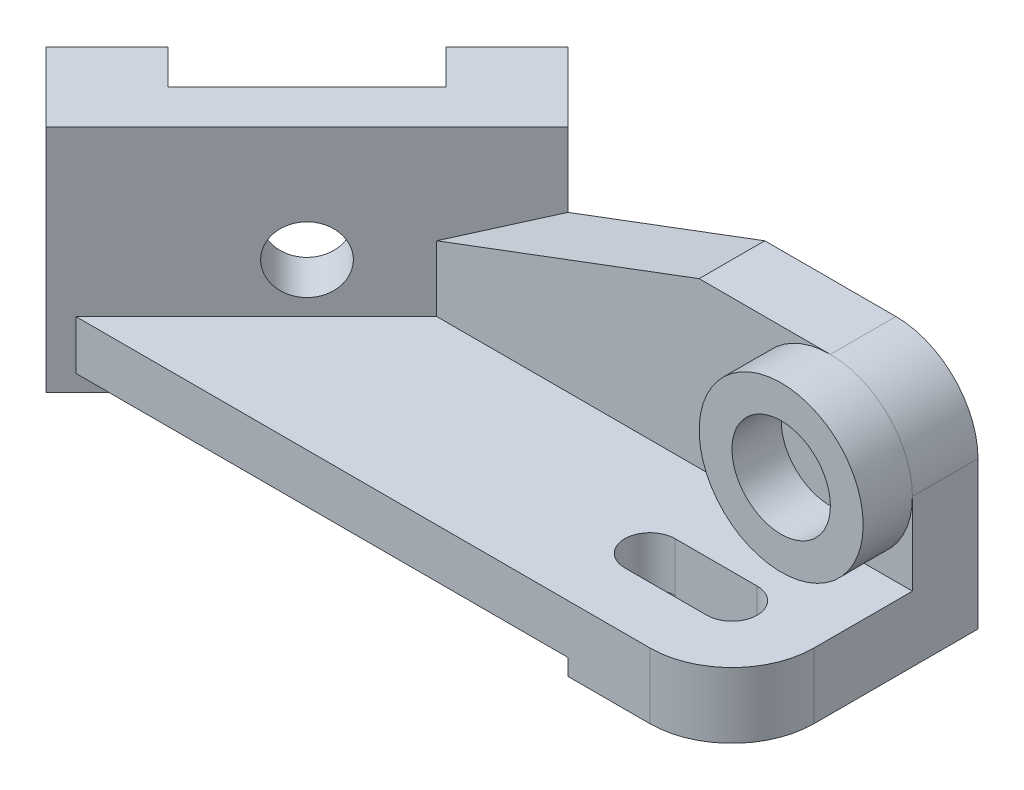
ISO-10303-21;
HEADER;
FILE_DESCRIPTION(('STEP AP214'),'2;1');
FILE_NAME('part.step','',(''),(''),'','','');
FILE_SCHEMA(('AUTOMOTIVE_DESIGN { 1 0 10303 214 1 1 1 1 }'));
ENDSEC;
DATA;
#1=APPLICATION_CONTEXT('core data for automotive mechanical design processes');
#2=APPLICATION_PROTOCOL_DEFINITION('international standard','automotive_design',2000,#1);
#3=PRODUCT_CONTEXT('',#1,'mechanical');
#4=PRODUCT('Part','Part','',(#3));
#5=PRODUCT_RELATED_PRODUCT_CATEGORY('part','',(#4));
#6=PRODUCT_DEFINITION_FORMATION('','',#4);
#7=PRODUCT_DEFINITION_CONTEXT('part definition',#1,'design');
#8=PRODUCT_DEFINITION('design','',#6,#7);
#9=PRODUCT_DEFINITION_SHAPE('','',#8);
#10=(LENGTH_UNIT() NAMED_UNIT(*) SI_UNIT(.MILLI.,.METRE.));
#11=(NAMED_UNIT(*) PLANE_ANGLE_UNIT() SI_UNIT($,.RADIAN.));
#12=(NAMED_UNIT(*) SI_UNIT($,.STERADIAN.) SOLID_ANGLE_UNIT());
#13=UNCERTAINTY_MEASURE_WITH_UNIT(LENGTH_MEASURE(1.E-05),#10,'distance_accuracy_value','');
#14=(GEOMETRIC_REPRESENTATION_CONTEXT(3) GLOBAL_UNCERTAINTY_ASSIGNED_CONTEXT((#13)) GLOBAL_UNIT_ASSIGNED_CONTEXT((#10,
#11,#12)) REPRESENTATION_CONTEXT('',''));
#15=CARTESIAN_POINT('',(0.,0.,0.));
#16=DIRECTION('',(0.,0.,1.));
#17=DIRECTION('',(1.,0.,0.));
#18=AXIS2_PLACEMENT_3D('',#15,#16,#17);
#19=CARTESIAN_POINT('',(0.,140.,0.));
#20=DIRECTION('',(0.,-1.,0.));
#21=DIRECTION('',(0.,0.,-1.));
#22=AXIS2_PLACEMENT_3D('',#19,#20,#21);
#23=PLANE('',#22);
#24=DIRECTION('',(0.707106781186548,0.,-0.707106781186548));
#25=VECTOR('',#24,1.);
#26=CARTESIAN_POINT('',(-250.,140.,-149.999999999998));
#27=LINE('',#26,#25);
#28=CARTESIAN_POINT('',(-409.099025766973,140.,9.09902576697477));
#29=VERTEX_POINT('',#28);
#30=CARTESIAN_POINT('',(-250.000000000002,140.,-150.));
#31=VERTEX_POINT('',#30);
#32=EDGE_CURVE('E315',#29,#31,#27,.T.);
#33=ORIENTED_EDGE('',*,*,#32,.T.);
#34=DIRECTION('',(-0.707106781186546,0.,-0.707106781186549));
#35=VECTOR('',#34,1.);
#36=CARTESIAN_POINT('',(-292.426406871193,140.,-192.426406871191));
#37=LINE('',#36,#35);
#38=CARTESIAN_POINT('',(-292.426406871193,140.,-192.426406871191));
#39=VERTEX_POINT('',#38);
#40=EDGE_CURVE('E317',#31,#39,#37,.T.);
#41=ORIENTED_EDGE('',*,*,#40,.T.);
#42=DIRECTION('',(-0.707106781186548,0.,0.707106781186547));
#43=VECTOR('',#42,1.);
#44=CARTESIAN_POINT('',(-329.549512883486,140.,-155.303300858897));
#45=LINE('',#44,#43);
#46=CARTESIAN_POINT('',(-329.549512883486,140.,-155.303300858897));
#47=VERTEX_POINT('',#46);
#48=EDGE_CURVE('E301',#39,#47,#45,.T.);
#49=ORIENTED_EDGE('',*,*,#48,.T.);
#50=DIRECTION('',(0.707106781186547,0.,0.707106781186548));
#51=VECTOR('',#50,1.);
#52=CARTESIAN_POINT('',(-308.33630944789,140.,-134.090097423301));
#53=LINE('',#52,#51);
#54=CARTESIAN_POINT('',(-308.33630944789,140.,-134.090097423301));
#55=VERTEX_POINT('',#54);
#56=EDGE_CURVE('E304',#47,#55,#53,.T.);
#57=ORIENTED_EDGE('',*,*,#56,.T.);
#58=DIRECTION('',(-0.707106781186547,0.,0.707106781186548));
#59=VECTOR('',#58,1.);
#60=CARTESIAN_POINT('',(-393.189123190276,140.,-49.2372836809154));
#61=LINE('',#60,#59);
#62=CARTESIAN_POINT('',(-393.189123190276,140.,-49.2372836809154));
#63=VERTEX_POINT('',#62);
#64=EDGE_CURVE('E307',#55,#63,#61,.T.);
#65=ORIENTED_EDGE('',*,*,#64,.T.);
#66=DIRECTION('',(-0.707106781186546,0.,-0.707106781186549));
#67=VECTOR('',#66,1.);
#68=CARTESIAN_POINT('',(-414.402326625872,140.,-70.4504871165119));
#69=LINE('',#68,#67);
#70=CARTESIAN_POINT('',(-414.402326625872,140.,-70.4504871165119));
#71=VERTEX_POINT('',#70);
#72=EDGE_CURVE('E309',#63,#71,#69,.T.);
#73=ORIENTED_EDGE('',*,*,#72,.T.);
#74=DIRECTION('',(-0.707106781186548,0.,0.707106781186547));
#75=VECTOR('',#74,1.);
#76=CARTESIAN_POINT('',(-451.525432638166,140.,-33.3273811042181));
#77=LINE('',#76,#75);
#78=CARTESIAN_POINT('',(-451.525432638166,140.,-33.3273811042181));
#79=VERTEX_POINT('',#78);
#80=EDGE_CURVE('E311',#71,#79,#77,.T.);
#81=ORIENTED_EDGE('',*,*,#80,.T.);
#82=DIRECTION('',(0.707106781186548,0.,0.707106781186547));
#83=VECTOR('',#82,1.);
#84=CARTESIAN_POINT('',(-409.099025766973,140.,9.09902576697477));
#85=LINE('',#84,#83);
#86=EDGE_CURVE('E313',#79,#29,#85,.T.);
#87=ORIENTED_EDGE('',*,*,#86,.T.);
#88=EDGE_LOOP('',(#33,#41,#49,#57,#65,#73,#81,#87));
#89=FACE_BOUND('',#88,.T.);
#90=ADVANCED_FACE('F33',(#89),#23,.F.);
#91=CARTESIAN_POINT('',(0.,432.745623366091,-110.));
#92=DIRECTION('',(0.,0.,-1.));
#93=DIRECTION('',(-1.,0.,0.));
#94=AXIS2_PLACEMENT_3D('',#91,#92,#93);
#95=PLANE('',#94);
#96=CARTESIAN_POINT('',(-50.,90.,-110.));
#97=DIRECTION('',(0.,0.,-1.));
#98=DIRECTION('',(-1.,0.,0.));
#99=AXIS2_PLACEMENT_3D('',#96,#97,#98);
#100=CIRCLE('',#99,50.);
#101=CARTESIAN_POINT('',(-50.,40.,-110.));
#102=VERTEX_POINT('',#101);
#103=CARTESIAN_POINT('',(0.,90.,-110.));
#104=VERTEX_POINT('',#103);
#105=EDGE_CURVE('E461',#102,#104,#100,.F.);
#106=ORIENTED_EDGE('',*,*,#105,.F.);
#107=DIRECTION('',(1.,0.,0.));
#108=VECTOR('',#107,1.);
#109=CARTESIAN_POINT('',(0.,40.,-110.));
#110=LINE('',#109,#108);
#111=CARTESIAN_POINT('',(0.,40.,-110.));
#112=VERTEX_POINT('',#111);
#113=EDGE_CURVE('E558',#102,#112,#110,.T.);
#114=ORIENTED_EDGE('',*,*,#113,.T.);
#115=DIRECTION('',(0.,-1.,0.));
#116=VECTOR('',#115,1.);
#117=CARTESIAN_POINT('',(0.,432.745623366091,-110.));
#118=LINE('',#117,#116);
#119=EDGE_CURVE('E563',#104,#112,#118,.T.);
#120=ORIENTED_EDGE('',*,*,#119,.F.);
#121=EDGE_LOOP('',(#106,#114,#120));
#122=FACE_BOUND('',#121,.T.);
#123=ADVANCED_FACE('F585',(#122),#95,.F.);
#124=CARTESIAN_POINT('',(-400.,40.,-150.));
#125=DIRECTION('',(0.,1.,0.));
#126=DIRECTION('',(0.,0.,1.));
#127=AXIS2_PLACEMENT_3D('',#124,#125,#126);
#128=PLANE('',#127);
#129=CARTESIAN_POINT('',(-50.,40.,-50.));
#130=DIRECTION('',(0.,1.,0.));
#131=DIRECTION('',(0.,0.,1.));
#132=AXIS2_PLACEMENT_3D('',#129,#130,#131);
#133=CIRCLE('',#132,15.3786470838639);
#134=CARTESIAN_POINT('',(-50.,40.,-34.6213529161361));
#135=VERTEX_POINT('',#134);
#136=CARTESIAN_POINT('',(-50.,40.,-65.378647083864));
#137=VERTEX_POINT('',#136);
#138=EDGE_CURVE('E366',#135,#137,#133,.T.);
#139=ORIENTED_EDGE('',*,*,#138,.F.);
#140=DIRECTION('',(1.,0.,0.));
#141=VECTOR('',#140,1.);
#142=CARTESIAN_POINT('',(-50.,40.,-34.6213529161361));
#143=LINE('',#142,#141);
#144=CARTESIAN_POINT('',(-100.,40.,-34.6213529161361));
#145=VERTEX_POINT('',#144);
#146=EDGE_CURVE('E371',#145,#135,#143,.T.);
#147=ORIENTED_EDGE('',*,*,#146,.F.);
#148=CARTESIAN_POINT('',(-100.,40.,-50.));
#149=DIRECTION('',(0.,1.,0.));
#150=DIRECTION('',(0.,0.,1.));
#151=AXIS2_PLACEMENT_3D('',#148,#149,#150);
#152=CIRCLE('',#151,15.3786470838639);
#153=CARTESIAN_POINT('',(-100.,40.,-65.3786470838639));
#154=VERTEX_POINT('',#153);
#155=EDGE_CURVE('E382',#154,#145,#152,.T.);
#156=ORIENTED_EDGE('',*,*,#155,.F.);
#157=DIRECTION('',(-1.,0.,0.));
#158=VECTOR('',#157,1.);
#159=CARTESIAN_POINT('',(-50.,40.,-65.378647083864));
#160=LINE('',#159,#158);
#161=EDGE_CURVE('E379',#137,#154,#160,.T.);
#162=ORIENTED_EDGE('',*,*,#161,.F.);
#163=EDGE_LOOP('',(#139,#147,#156,#162));
#164=FACE_BOUND('',#163,.T.);
#165=DIRECTION('',(0.,0.,1.));
#166=VECTOR('',#165,1.);
#167=CARTESIAN_POINT('',(0.,40.,-150.));
#168=LINE('',#167,#166);
#169=CARTESIAN_POINT('',(0.,40.,-50.));
#170=VERTEX_POINT('',#169);
#171=EDGE_CURVE('E422',#112,#170,#168,.T.);
#172=ORIENTED_EDGE('',*,*,#171,.F.);
#173=ORIENTED_EDGE('',*,*,#113,.F.);
#174=CARTESIAN_POINT('',(-290.000000000002,40.,-110.));
#175=VERTEX_POINT('',#174);
#176=EDGE_CURVE('E499',#175,#102,#110,.T.);
#177=ORIENTED_EDGE('',*,*,#176,.F.);
#178=DIRECTION('',(0.707106781186544,0.,-0.707106781186552));
#179=VECTOR('',#178,1.);
#180=CARTESIAN_POINT('',(-400.,40.,0.));
#181=LINE('',#180,#179);
#182=CARTESIAN_POINT('',(-399.999999999998,40.,0.));
#183=VERTEX_POINT('',#182);
#184=EDGE_CURVE('E400',#183,#175,#181,.T.);
#185=ORIENTED_EDGE('',*,*,#184,.F.);
#186=DIRECTION('',(-1.,0.,0.));
#187=VECTOR('',#186,1.);
#188=CARTESIAN_POINT('',(-400.,40.,0.));
#189=LINE('',#188,#187);
#190=CARTESIAN_POINT('',(-50.,40.,0.));
#191=VERTEX_POINT('',#190);
#192=EDGE_CURVE('E409',#191,#183,#189,.T.);
#193=ORIENTED_EDGE('',*,*,#192,.F.);
#194=CARTESIAN_POINT('',(-50.,40.,-50.));
#195=DIRECTION('',(0.,1.,0.));
#196=DIRECTION('',(0.,0.,1.));
#197=AXIS2_PLACEMENT_3D('',#194,#195,#196);
#198=CIRCLE('',#197,50.);
#199=EDGE_CURVE('E451',#191,#170,#198,.T.);
#200=ORIENTED_EDGE('',*,*,#199,.T.);
#201=EDGE_LOOP('',(#172,#173,#177,#185,#193,#200));
#202=FACE_BOUND('',#201,.T.);
#203=ADVANCED_FACE('F496',(#164,#202),#128,.T.);
#204=CARTESIAN_POINT('',(-250.,140.,-149.999999999998));
#205=DIRECTION('',(-0.707106781186548,0.,-0.707106781186548));
#206=DIRECTION('',(-0.707106781186548,0.,0.707106781186548));
#207=AXIS2_PLACEMENT_3D('',#204,#205,#206);
#208=PLANE('',#207);
#209=CARTESIAN_POINT('',(-329.549512883487,70.,-70.4504871165117));
#210=DIRECTION('',(-0.707106781186548,0.,-0.707106781186548));
#211=DIRECTION('',(-0.707106781186548,0.,0.707106781186548));
#212=AXIS2_PLACEMENT_3D('',#209,#210,#211);
#213=CIRCLE('',#212,20.);
#214=CARTESIAN_POINT('',(-343.691648507217,70.,-56.3083514927808));
#215=VERTEX_POINT('',#214);
#216=EDGE_CURVE('E282',#215,#215,#213,.F.);
#217=ORIENTED_EDGE('',*,*,#216,.F.);
#218=EDGE_LOOP('',(#217));
#219=FACE_BOUND('',#218,.T.);
#220=DIRECTION('',(0.,-1.,0.));
#221=VECTOR('',#220,1.);
#222=CARTESIAN_POINT('',(-290.000000000002,432.745623366091,-110.));
#223=LINE('',#222,#221);
#224=CARTESIAN_POINT('',(-290.000000000002,80.,-110.));
#225=VERTEX_POINT('',#224);
#226=EDGE_CURVE('E503',#225,#175,#223,.T.);
#227=ORIENTED_EDGE('',*,*,#226,.F.);
#228=DIRECTION('',(0.683486126173409,0.256307297315028,-0.683486126173409));
#229=VECTOR('',#228,1.);
#230=CARTESIAN_POINT('',(-304.887671676443,74.4171231213345,-95.1123283235585));
#231=LINE('',#230,#229);
#232=CARTESIAN_POINT('',(-250.,95.0000000000007,-149.999999999998));
#233=VERTEX_POINT('',#232);
#234=EDGE_CURVE('E48',#225,#233,#231,.T.);
#235=ORIENTED_EDGE('',*,*,#234,.T.);
#236=DIRECTION('',(0.,1.,0.));
#237=VECTOR('',#236,1.);
#238=CARTESIAN_POINT('',(-250.000000000002,-4.98379248635319,-150.));
#239=LINE('',#238,#237);
#240=EDGE_CURVE('E537',#233,#31,#239,.T.);
#241=ORIENTED_EDGE('',*,*,#240,.T.);
#242=ORIENTED_EDGE('',*,*,#32,.F.);
#243=DIRECTION('',(0.,-1.,0.));
#244=VECTOR('',#243,1.);
#245=CARTESIAN_POINT('',(-409.099025766973,140.,9.09902576697477));
#246=LINE('',#245,#244);
#247=CARTESIAN_POINT('',(-409.099025766973,0.,9.09902576697477));
#248=VERTEX_POINT('',#247);
#249=EDGE_CURVE('E345',#29,#248,#246,.T.);
#250=ORIENTED_EDGE('',*,*,#249,.T.);
#251=DIRECTION('',(0.707106781186548,0.,-0.707106781186548));
#252=VECTOR('',#251,1.);
#253=CARTESIAN_POINT('',(-250.,0.,-149.999999999998));
#254=LINE('',#253,#252);
#255=CARTESIAN_POINT('',(-250.,0.,-149.999999999998));
#256=VERTEX_POINT('',#255);
#257=EDGE_CURVE('E336',#248,#256,#254,.T.);
#258=ORIENTED_EDGE('',*,*,#257,.T.);
#259=DIRECTION('',(0.,-1.,0.));
#260=VECTOR('',#259,1.);
#261=CARTESIAN_POINT('',(-250.,140.,-149.999999999998));
#262=LINE('',#261,#260);
#263=CARTESIAN_POINT('',(-250.,9.99999999999995,-149.999999999998));
#264=VERTEX_POINT('',#263);
#265=EDGE_CURVE('E343',#264,#256,#262,.T.);
#266=ORIENTED_EDGE('',*,*,#265,.F.);
#267=DIRECTION('',(0.707106781186543,0.,-0.707106781186552));
#268=VECTOR('',#267,1.);
#269=CARTESIAN_POINT('',(-400.,9.99999999999995,0.));
#270=LINE('',#269,#268);
#271=CARTESIAN_POINT('',(-399.999999999998,9.99999999999995,0.));
#272=VERTEX_POINT('',#271);
#273=EDGE_CURVE('E406',#272,#264,#270,.T.);
#274=ORIENTED_EDGE('',*,*,#273,.F.);
#275=DIRECTION('',(0.,-1.,0.));
#276=VECTOR('',#275,1.);
#277=CARTESIAN_POINT('',(-400.,9.99999999999995,0.));
#278=LINE('',#277,#276);
#279=EDGE_CURVE('E425',#183,#272,#278,.T.);
#280=ORIENTED_EDGE('',*,*,#279,.F.);
#281=ORIENTED_EDGE('',*,*,#184,.T.);
#282=EDGE_LOOP('',(#227,#235,#241,#242,#250,#258,#266,#274,#280,#281));
#283=FACE_BOUND('',#282,.T.);
#284=ADVANCED_FACE('F502',(#219,#283),#208,.F.);
#285=CARTESIAN_POINT('',(-329.549512883486,140.,-155.303300858897));
#286=DIRECTION('',(0.707106781186547,0.,0.707106781186548));
#287=DIRECTION('',(0.707106781186548,0.,-0.707106781186547));
#288=AXIS2_PLACEMENT_3D('',#285,#286,#287);
#289=PLANE('',#288);
#290=DIRECTION('',(0.,-1.,0.));
#291=VECTOR('',#290,1.);
#292=CARTESIAN_POINT('',(-292.426406871193,140.,-192.426406871191));
#293=LINE('',#292,#291);
#294=CARTESIAN_POINT('',(-292.426406871193,120.,-192.426406871191));
#295=VERTEX_POINT('',#294);
#296=EDGE_CURVE('E341',#39,#295,#293,.T.);
#297=ORIENTED_EDGE('',*,*,#296,.T.);
#298=DIRECTION('',(-0.707106781186547,0.,0.707106781186547));
#299=VECTOR('',#298,1.);
#300=CARTESIAN_POINT('',(-292.426406871193,120.,-192.426406871191));
#301=LINE('',#300,#299);
#302=CARTESIAN_POINT('',(-329.549512883486,120.,-155.303300858897));
#303=VERTEX_POINT('',#302);
#304=EDGE_CURVE('E270',#295,#303,#301,.T.);
#305=ORIENTED_EDGE('',*,*,#304,.T.);
#306=DIRECTION('',(0.,-1.,0.));
#307=VECTOR('',#306,1.);
#308=CARTESIAN_POINT('',(-329.549512883486,140.,-155.303300858897));
#309=LINE('',#308,#307);
#310=EDGE_CURVE('E363',#47,#303,#309,.T.);
#311=ORIENTED_EDGE('',*,*,#310,.F.);
#312=ORIENTED_EDGE('',*,*,#48,.F.);
#313=EDGE_LOOP('',(#297,#305,#311,#312));
#314=FACE_BOUND('',#313,.T.);
#315=ADVANCED_FACE('F574',(#314),#289,.F.);
#316=CARTESIAN_POINT('',(-308.33630944789,140.,-134.090097423301));
#317=DIRECTION('',(0.707106781186548,0.,-0.707106781186547));
#318=DIRECTION('',(-0.707106781186547,0.,-0.707106781186548));
#319=AXIS2_PLACEMENT_3D('',#316,#317,#318);
#320=PLANE('',#319);
#321=ORIENTED_EDGE('',*,*,#310,.T.);
#322=DIRECTION('',(0.588348405414552,-0.554700196225229,0.588348405414553));
#323=VECTOR('',#322,1.);
#324=CARTESIAN_POINT('',(-321.39058848518,112.307692307692,-147.144376460591));
#325=LINE('',#324,#323);
#326=CARTESIAN_POINT('',(-308.33630944789,100.,-134.090097423301));
#327=VERTEX_POINT('',#326);
#328=EDGE_CURVE('E298',#303,#327,#325,.T.);
#329=ORIENTED_EDGE('',*,*,#328,.T.);
#330=DIRECTION('',(0.,-1.,0.));
#331=VECTOR('',#330,1.);
#332=CARTESIAN_POINT('',(-308.33630944789,140.,-134.090097423301));
#333=LINE('',#332,#331);
#334=EDGE_CURVE('E263',#55,#327,#333,.T.);
#335=ORIENTED_EDGE('',*,*,#334,.F.);
#336=ORIENTED_EDGE('',*,*,#56,.F.);
#337=EDGE_LOOP('',(#321,#329,#335,#336));
#338=FACE_BOUND('',#337,.T.);
#339=ADVANCED_FACE('F580',(#338),#320,.F.);
#340=CARTESIAN_POINT('',(-414.402326625872,140.,-70.4504871165119));
#341=DIRECTION('',(-0.707106781186549,0.,0.707106781186546));
#342=DIRECTION('',(0.707106781186546,0.,0.707106781186549));
#343=AXIS2_PLACEMENT_3D('',#340,#341,#342);
#344=PLANE('',#343);
#345=DIRECTION('',(0.,-1.,0.));
#346=VECTOR('',#345,1.);
#347=CARTESIAN_POINT('',(-393.189123190276,140.,-49.2372836809154));
#348=LINE('',#347,#346);
#349=CARTESIAN_POINT('',(-393.189123190276,100.,-49.2372836809154));
#350=VERTEX_POINT('',#349);
#351=EDGE_CURVE('E357',#63,#350,#348,.T.);
#352=ORIENTED_EDGE('',*,*,#351,.T.);
#353=DIRECTION('',(-0.588348405414551,0.554700196225229,-0.588348405414553));
#354=VECTOR('',#353,1.);
#355=CARTESIAN_POINT('',(-420.929466144517,126.153846153846,-76.9776266351569));
#356=LINE('',#355,#354);
#357=CARTESIAN_POINT('',(-414.402326625872,120.,-70.4504871165118));
#358=VERTEX_POINT('',#357);
#359=EDGE_CURVE('E296',#350,#358,#356,.T.);
#360=ORIENTED_EDGE('',*,*,#359,.T.);
#361=DIRECTION('',(0.,-1.,0.));
#362=VECTOR('',#361,1.);
#363=CARTESIAN_POINT('',(-414.402326625872,140.,-70.4504871165119));
#364=LINE('',#363,#362);
#365=EDGE_CURVE('E353',#71,#358,#364,.T.);
#366=ORIENTED_EDGE('',*,*,#365,.F.);
#367=ORIENTED_EDGE('',*,*,#72,.F.);
#368=EDGE_LOOP('',(#352,#360,#366,#367));
#369=FACE_BOUND('',#368,.T.);
#370=ADVANCED_FACE('F626',(#369),#344,.F.);
#371=CARTESIAN_POINT('',(-451.525432638166,140.,-33.3273811042181));
#372=DIRECTION('',(0.707106781186547,0.,0.707106781186548));
#373=DIRECTION('',(0.707106781186548,0.,-0.707106781186547));
#374=AXIS2_PLACEMENT_3D('',#371,#372,#373);
#375=PLANE('',#374);
#376=ORIENTED_EDGE('',*,*,#365,.T.);
#377=CARTESIAN_POINT('',(-451.525432638166,120.,-33.327381104218));
#378=VERTEX_POINT('',#377);
#379=EDGE_CURVE('E265',#358,#378,#301,.T.);
#380=ORIENTED_EDGE('',*,*,#379,.T.);
#381=DIRECTION('',(0.,-1.,0.));
#382=VECTOR('',#381,1.);
#383=CARTESIAN_POINT('',(-451.525432638166,140.,-33.3273811042181));
#384=LINE('',#383,#382);
#385=EDGE_CURVE('E349',#79,#378,#384,.T.);
#386=ORIENTED_EDGE('',*,*,#385,.F.);
#387=ORIENTED_EDGE('',*,*,#80,.F.);
#388=EDGE_LOOP('',(#376,#380,#386,#387));
#389=FACE_BOUND('',#388,.T.);
#390=ADVANCED_FACE('F621',(#389),#375,.F.);
#391=CARTESIAN_POINT('',(-100.,0.,-150.));
#392=DIRECTION('',(-1.,0.,0.));
#393=DIRECTION('',(0.,0.,1.));
#394=AXIS2_PLACEMENT_3D('',#391,#392,#393);
#395=PLANE('',#394);
#396=DIRECTION('',(0.,1.,0.));
#397=VECTOR('',#396,1.);
#398=CARTESIAN_POINT('',(-100.,0.,-34.6213529161361));
#399=LINE('',#398,#397);
#400=CARTESIAN_POINT('',(-100.,0.,-34.6213529161361));
#401=VERTEX_POINT('',#400);
#402=CARTESIAN_POINT('',(-100.,9.99999999999999,-34.6213529161361));
#403=VERTEX_POINT('',#402);
#404=EDGE_CURVE('E390',#401,#403,#399,.T.);
#405=ORIENTED_EDGE('',*,*,#404,.F.);
#406=DIRECTION('',(0.,0.,1.));
#407=VECTOR('',#406,1.);
#408=CARTESIAN_POINT('',(-100.,0.,-150.));
#409=LINE('',#408,#407);
#410=CARTESIAN_POINT('',(-100.,0.,0.));
#411=VERTEX_POINT('',#410);
#412=EDGE_CURVE('E443',#401,#411,#409,.T.);
#413=ORIENTED_EDGE('',*,*,#412,.T.);
#414=DIRECTION('',(0.,-1.,0.));
#415=VECTOR('',#414,1.);
#416=CARTESIAN_POINT('',(-100.,0.,0.));
#417=LINE('',#416,#415);
#418=CARTESIAN_POINT('',(-100.,9.99999999999999,0.));
#419=VERTEX_POINT('',#418);
#420=EDGE_CURVE('E431',#419,#411,#417,.T.);
#421=ORIENTED_EDGE('',*,*,#420,.F.);
#422=DIRECTION('',(0.,0.,1.));
#423=VECTOR('',#422,1.);
#424=CARTESIAN_POINT('',(-100.,9.99999999999999,-150.));
#425=LINE('',#424,#423);
#426=EDGE_CURVE('E447',#403,#419,#425,.T.);
#427=ORIENTED_EDGE('',*,*,#426,.F.);
#428=EDGE_LOOP('',(#405,#413,#421,#427));
#429=FACE_BOUND('',#428,.T.);
#430=ADVANCED_FACE('F513',(#429),#395,.T.);
#431=CARTESIAN_POINT('',(0.,40.,-150.));
#432=DIRECTION('',(1.,0.,0.));
#433=DIRECTION('',(0.,1.,0.));
#434=AXIS2_PLACEMENT_3D('',#431,#432,#433);
#435=PLANE('',#434);
#436=DIRECTION('',(0.,1.,0.));
#437=VECTOR('',#436,1.);
#438=CARTESIAN_POINT('',(0.,40.,-150.));
#439=LINE('',#438,#437);
#440=CARTESIAN_POINT('',(0.,0.,-150.));
#441=VERTEX_POINT('',#440);
#442=CARTESIAN_POINT('',(0.,90.,-150.));
#443=VERTEX_POINT('',#442);
#444=EDGE_CURVE('E410',#441,#443,#439,.T.);
#445=ORIENTED_EDGE('',*,*,#444,.T.);
#446=DIRECTION('',(0.,0.,1.));
#447=VECTOR('',#446,1.);
#448=CARTESIAN_POINT('',(0.,90.,-110.));
#449=LINE('',#448,#447);
#450=EDGE_CURVE('E462',#443,#104,#449,.T.);
#451=ORIENTED_EDGE('',*,*,#450,.T.);
#452=ORIENTED_EDGE('',*,*,#119,.T.);
#453=ORIENTED_EDGE('',*,*,#171,.T.);
#454=DIRECTION('',(0.,1.,0.));
#455=VECTOR('',#454,1.);
#456=CARTESIAN_POINT('',(0.,0.,-50.));
#457=LINE('',#456,#455);
#458=CARTESIAN_POINT('',(0.,0.,-50.));
#459=VERTEX_POINT('',#458);
#460=EDGE_CURVE('E454',#170,#459,#457,.F.);
#461=ORIENTED_EDGE('',*,*,#460,.T.);
#462=DIRECTION('',(0.,0.,1.));
#463=VECTOR('',#462,1.);
#464=CARTESIAN_POINT('',(0.,0.,-150.));
#465=LINE('',#464,#463);
#466=EDGE_CURVE('E436',#441,#459,#465,.T.);
#467=ORIENTED_EDGE('',*,*,#466,.F.);
#468=EDGE_LOOP('',(#445,#451,#452,#453,#461,#467));
#469=FACE_BOUND('',#468,.T.);
#470=ADVANCED_FACE('F479',(#469),#435,.T.);
#471=CARTESIAN_POINT('',(0.,0.,-150.));
#472=DIRECTION('',(0.,-1.,0.));
#473=DIRECTION('',(1.,0.,0.));
#474=AXIS2_PLACEMENT_3D('',#471,#472,#473);
#475=PLANE('',#474);
#476=DIRECTION('',(1.,0.,0.));
#477=VECTOR('',#476,1.);
#478=CARTESIAN_POINT('',(-50.,0.,-34.6213529161361));
#479=LINE('',#478,#477);
#480=CARTESIAN_POINT('',(-50.,0.,-34.6213529161361));
#481=VERTEX_POINT('',#480);
#482=EDGE_CURVE('E374',#401,#481,#479,.T.);
#483=ORIENTED_EDGE('',*,*,#482,.T.);
#484=CARTESIAN_POINT('',(-50.,0.,-50.));
#485=DIRECTION('',(0.,1.,0.));
#486=DIRECTION('',(0.,0.,1.));
#487=AXIS2_PLACEMENT_3D('',#484,#485,#486);
#488=CIRCLE('',#487,15.3786470838639);
#489=CARTESIAN_POINT('',(-50.,0.,-65.378647083864));
#490=VERTEX_POINT('',#489);
#491=EDGE_CURVE('E367',#481,#490,#488,.T.);
#492=ORIENTED_EDGE('',*,*,#491,.T.);
#493=DIRECTION('',(-1.,0.,0.));
#494=VECTOR('',#493,1.);
#495=CARTESIAN_POINT('',(-50.,0.,-65.378647083864));
#496=LINE('',#495,#494);
#497=CARTESIAN_POINT('',(-100.,0.,-65.3786470838639));
#498=VERTEX_POINT('',#497);
#499=EDGE_CURVE('E370',#490,#498,#496,.T.);
#500=ORIENTED_EDGE('',*,*,#499,.T.);
#501=CARTESIAN_POINT('',(-100.,0.,-150.));
#502=VERTEX_POINT('',#501);
#503=EDGE_CURVE('E440',#502,#498,#409,.T.);
#504=ORIENTED_EDGE('',*,*,#503,.F.);
#505=DIRECTION('',(1.,0.,0.));
#506=VECTOR('',#505,1.);
#507=CARTESIAN_POINT('',(0.,0.,-150.));
#508=LINE('',#507,#506);
#509=EDGE_CURVE('E419',#502,#441,#508,.T.);
#510=ORIENTED_EDGE('',*,*,#509,.T.);
#511=ORIENTED_EDGE('',*,*,#466,.T.);
#512=CARTESIAN_POINT('',(-50.,0.,-50.));
#513=DIRECTION('',(0.,-1.,0.));
#514=DIRECTION('',(1.,0.,0.));
#515=AXIS2_PLACEMENT_3D('',#512,#513,#514);
#516=CIRCLE('',#515,50.);
#517=CARTESIAN_POINT('',(-50.,0.,0.));
#518=VERTEX_POINT('',#517);
#519=EDGE_CURVE('E456',#459,#518,#516,.T.);
#520=ORIENTED_EDGE('',*,*,#519,.T.);
#521=DIRECTION('',(1.,0.,0.));
#522=VECTOR('',#521,1.);
#523=CARTESIAN_POINT('',(0.,0.,0.));
#524=LINE('',#523,#522);
#525=EDGE_CURVE('E414',#411,#518,#524,.T.);
#526=ORIENTED_EDGE('',*,*,#525,.F.);
#527=ORIENTED_EDGE('',*,*,#412,.F.);
#528=EDGE_LOOP('',(#483,#492,#500,#504,#510,#511,#520,#526,#527));
#529=FACE_BOUND('',#528,.T.);
#530=ADVANCED_FACE('F485',(#529),#475,.T.);
#531=DIRECTION('',(0.,1.,0.));
#532=VECTOR('',#531,1.);
#533=CARTESIAN_POINT('',(-100.,0.,-65.3786470838639));
#534=LINE('',#533,#532);
#535=CARTESIAN_POINT('',(-100.,9.99999999999999,-65.3786470838639));
#536=VERTEX_POINT('',#535);
#537=EDGE_CURVE('E393',#498,#536,#534,.T.);
#538=ORIENTED_EDGE('',*,*,#537,.T.);
#539=CARTESIAN_POINT('',(-100.,9.99999999999999,-150.));
#540=VERTEX_POINT('',#539);
#541=EDGE_CURVE('E444',#540,#536,#425,.T.);
#542=ORIENTED_EDGE('',*,*,#541,.F.);
#543=DIRECTION('',(0.,-1.,0.));
#544=VECTOR('',#543,1.);
#545=CARTESIAN_POINT('',(-100.,0.,-150.));
#546=LINE('',#545,#544);
#547=EDGE_CURVE('E416',#540,#502,#546,.T.);
#548=ORIENTED_EDGE('',*,*,#547,.T.);
#549=ORIENTED_EDGE('',*,*,#503,.T.);
#550=EDGE_LOOP('',(#538,#542,#548,#549));
#551=FACE_BOUND('',#550,.T.);
#552=ADVANCED_FACE('F529',(#551),#395,.T.);
#553=CARTESIAN_POINT('',(-100.,9.99999999999999,-150.));
#554=DIRECTION('',(0.,-1.,0.));
#555=DIRECTION('',(1.,0.,0.));
#556=AXIS2_PLACEMENT_3D('',#553,#554,#555);
#557=PLANE('',#556);
#558=CARTESIAN_POINT('',(-100.,9.99999999999999,-50.));
#559=DIRECTION('',(0.,-1.,0.));
#560=DIRECTION('',(1.,0.,0.));
#561=AXIS2_PLACEMENT_3D('',#558,#559,#560);
#562=CIRCLE('',#561,15.3786470838639);
#563=EDGE_CURVE('E389',#403,#536,#562,.T.);
#564=ORIENTED_EDGE('',*,*,#563,.F.);
#565=ORIENTED_EDGE('',*,*,#426,.T.);
#566=DIRECTION('',(1.,0.,0.));
#567=VECTOR('',#566,1.);
#568=CARTESIAN_POINT('',(-100.,9.99999999999999,0.));
#569=LINE('',#568,#567);
#570=EDGE_CURVE('E428',#272,#419,#569,.T.);
#571=ORIENTED_EDGE('',*,*,#570,.F.);
#572=ORIENTED_EDGE('',*,*,#273,.T.);
#573=DIRECTION('',(1.,0.,0.));
#574=VECTOR('',#573,1.);
#575=CARTESIAN_POINT('',(-100.,9.99999999999999,-150.));
#576=LINE('',#575,#574);
#577=EDGE_CURVE('E413',#264,#540,#576,.T.);
#578=ORIENTED_EDGE('',*,*,#577,.T.);
#579=ORIENTED_EDGE('',*,*,#541,.T.);
#580=EDGE_LOOP('',(#564,#565,#571,#572,#578,#579));
#581=FACE_BOUND('',#580,.T.);
#582=ADVANCED_FACE('F508',(#581),#557,.T.);
#583=CARTESIAN_POINT('',(0.,0.,-150.));
#584=DIRECTION('',(0.,0.,-1.));
#585=DIRECTION('',(-1.,0.,0.));
#586=AXIS2_PLACEMENT_3D('',#583,#584,#585);
#587=PLANE('',#586);
#588=DIRECTION('',(0.936329177569045,0.351123441588392,0.));
#589=VECTOR('',#588,1.);
#590=CARTESIAN_POINT('',(-290.000000000002,80.,-150.));
#591=LINE('',#590,#589);
#592=CARTESIAN_POINT('',(-130.000000000002,140.,-149.999999999999));
#593=VERTEX_POINT('',#592);
#594=EDGE_CURVE('E534',#233,#593,#591,.T.);
#595=ORIENTED_EDGE('',*,*,#594,.T.);
#596=DIRECTION('',(1.,0.,0.));
#597=VECTOR('',#596,1.);
#598=CARTESIAN_POINT('',(-250.000000000002,140.,-150.));
#599=LINE('',#598,#597);
#600=CARTESIAN_POINT('',(-50.,140.,-150.));
#601=VERTEX_POINT('',#600);
#602=EDGE_CURVE('E55',#593,#601,#599,.T.);
#603=ORIENTED_EDGE('',*,*,#602,.T.);
#604=CARTESIAN_POINT('',(-50.,90.,-150.));
#605=DIRECTION('',(0.,0.,-1.));
#606=DIRECTION('',(-1.,0.,0.));
#607=AXIS2_PLACEMENT_3D('',#604,#605,#606);
#608=CIRCLE('',#607,50.);
#609=EDGE_CURVE('E11',#601,#443,#608,.T.);
#610=ORIENTED_EDGE('',*,*,#609,.T.);
#611=ORIENTED_EDGE('',*,*,#444,.F.);
#612=ORIENTED_EDGE('',*,*,#509,.F.);
#613=ORIENTED_EDGE('',*,*,#547,.F.);
#614=ORIENTED_EDGE('',*,*,#577,.F.);
#615=DIRECTION('',(0.,1.,0.));
#616=VECTOR('',#615,1.);
#617=CARTESIAN_POINT('',(-250.000000000002,-0.00100000000001488,-150.));
#618=LINE('',#617,#616);
#619=EDGE_CURVE('E403',#264,#233,#618,.T.);
#620=ORIENTED_EDGE('',*,*,#619,.T.);
#621=EDGE_LOOP('',(#595,#603,#610,#611,#612,#613,#614,#620));
#622=FACE_BOUND('',#621,.T.);
#623=ADVANCED_FACE('F476',(#622),#587,.T.);
#624=CARTESIAN_POINT('',(0.,0.,0.));
#625=DIRECTION('',(0.,0.,-1.));
#626=DIRECTION('',(-1.,0.,0.));
#627=AXIS2_PLACEMENT_3D('',#624,#625,#626);
#628=PLANE('',#627);
#629=ORIENTED_EDGE('',*,*,#525,.T.);
#630=DIRECTION('',(0.,1.,0.));
#631=VECTOR('',#630,1.);
#632=CARTESIAN_POINT('',(-50.,40.,0.));
#633=LINE('',#632,#631);
#634=EDGE_CURVE('E439',#518,#191,#633,.T.);
#635=ORIENTED_EDGE('',*,*,#634,.T.);
#636=ORIENTED_EDGE('',*,*,#192,.T.);
#637=ORIENTED_EDGE('',*,*,#279,.T.);
#638=ORIENTED_EDGE('',*,*,#570,.T.);
#639=ORIENTED_EDGE('',*,*,#420,.T.);
#640=EDGE_LOOP('',(#629,#635,#636,#637,#638,#639));
#641=FACE_BOUND('',#640,.T.);
#642=ADVANCED_FACE('F492',(#641),#628,.F.);
#643=CARTESIAN_POINT('',(-50.,0.,-50.));
#644=DIRECTION('',(0.,-1.,0.));
#645=DIRECTION('',(1.,0.,0.));
#646=AXIS2_PLACEMENT_3D('',#643,#644,#645);
#647=CYLINDRICAL_SURFACE('',#646,50.);
#648=ORIENTED_EDGE('',*,*,#519,.F.);
#649=ORIENTED_EDGE('',*,*,#460,.F.);
#650=ORIENTED_EDGE('',*,*,#199,.F.);
#651=ORIENTED_EDGE('',*,*,#634,.F.);
#652=EDGE_LOOP('',(#648,#649,#650,#651));
#653=FACE_BOUND('',#652,.T.);
#654=ADVANCED_FACE('F489',(#653),#647,.T.);
#655=CARTESIAN_POINT('',(-50.,0.,-50.));
#656=DIRECTION('',(0.,1.,0.));
#657=DIRECTION('',(0.,0.,1.));
#658=AXIS2_PLACEMENT_3D('',#655,#656,#657);
#659=CYLINDRICAL_SURFACE('',#658,15.3786470838639);
#660=ORIENTED_EDGE('',*,*,#138,.T.);
#661=DIRECTION('',(0.,1.,0.));
#662=VECTOR('',#661,1.);
#663=CARTESIAN_POINT('',(-50.,0.,-65.378647083864));
#664=LINE('',#663,#662);
#665=EDGE_CURVE('E377',#490,#137,#664,.T.);
#666=ORIENTED_EDGE('',*,*,#665,.F.);
#667=ORIENTED_EDGE('',*,*,#491,.F.);
#668=DIRECTION('',(0.,1.,0.));
#669=VECTOR('',#668,1.);
#670=CARTESIAN_POINT('',(-50.,0.,-34.6213529161361));
#671=LINE('',#670,#669);
#672=EDGE_CURVE('E387',#481,#135,#671,.T.);
#673=ORIENTED_EDGE('',*,*,#672,.T.);
#674=EDGE_LOOP('',(#660,#666,#667,#673));
#675=FACE_BOUND('',#674,.T.);
#676=ADVANCED_FACE('F522',(#675),#659,.F.);
#677=CARTESIAN_POINT('',(-50.,0.,-34.6213529161361));
#678=DIRECTION('',(0.,0.,1.));
#679=DIRECTION('',(1.,0.,0.));
#680=AXIS2_PLACEMENT_3D('',#677,#678,#679);
#681=PLANE('',#680);
#682=ORIENTED_EDGE('',*,*,#146,.T.);
#683=ORIENTED_EDGE('',*,*,#672,.F.);
#684=ORIENTED_EDGE('',*,*,#482,.F.);
#685=ORIENTED_EDGE('',*,*,#404,.T.);
#686=EDGE_CURVE('E392',#403,#145,#399,.T.);
#687=ORIENTED_EDGE('',*,*,#686,.T.);
#688=EDGE_LOOP('',(#682,#683,#684,#685,#687));
#689=FACE_BOUND('',#688,.T.);
#690=ADVANCED_FACE('F517',(#689),#681,.F.);
#691=CARTESIAN_POINT('',(-100.,0.,-50.));
#692=DIRECTION('',(0.,1.,0.));
#693=DIRECTION('',(0.,0.,1.));
#694=AXIS2_PLACEMENT_3D('',#691,#692,#693);
#695=CYLINDRICAL_SURFACE('',#694,15.3786470838639);
#696=ORIENTED_EDGE('',*,*,#563,.T.);
#697=EDGE_CURVE('E396',#536,#154,#534,.T.);
#698=ORIENTED_EDGE('',*,*,#697,.T.);
#699=ORIENTED_EDGE('',*,*,#155,.T.);
#700=ORIENTED_EDGE('',*,*,#686,.F.);
#701=EDGE_LOOP('',(#696,#698,#699,#700));
#702=FACE_BOUND('',#701,.T.);
#703=ADVANCED_FACE('F638',(#702),#695,.F.);
#704=CARTESIAN_POINT('',(-50.,0.,-65.378647083864));
#705=DIRECTION('',(0.,0.,-1.));
#706=DIRECTION('',(-1.,0.,0.));
#707=AXIS2_PLACEMENT_3D('',#704,#705,#706);
#708=PLANE('',#707);
#709=ORIENTED_EDGE('',*,*,#161,.T.);
#710=ORIENTED_EDGE('',*,*,#697,.F.);
#711=ORIENTED_EDGE('',*,*,#537,.F.);
#712=ORIENTED_EDGE('',*,*,#499,.F.);
#713=ORIENTED_EDGE('',*,*,#665,.T.);
#714=EDGE_LOOP('',(#709,#710,#711,#712,#713));
#715=FACE_BOUND('',#714,.T.);
#716=ADVANCED_FACE('F526',(#715),#708,.F.);
#717=CARTESIAN_POINT('',(-329.549512883486,20.,-155.303300858897));
#718=VERTEX_POINT('',#717);
#719=CARTESIAN_POINT('',(-329.549512883486,0.,-155.303300858897));
#720=VERTEX_POINT('',#719);
#721=EDGE_CURVE('E362',#718,#720,#309,.T.);
#722=ORIENTED_EDGE('',*,*,#721,.F.);
#723=DIRECTION('',(-0.707106781186547,0.,0.707106781186547));
#724=VECTOR('',#723,1.);
#725=CARTESIAN_POINT('',(-292.426406871193,20.,-192.426406871191));
#726=LINE('',#725,#724);
#727=CARTESIAN_POINT('',(-292.426406871193,20.,-192.426406871191));
#728=VERTEX_POINT('',#727);
#729=EDGE_CURVE('E274',#728,#718,#726,.T.);
#730=ORIENTED_EDGE('',*,*,#729,.F.);
#731=CARTESIAN_POINT('',(-292.426406871193,0.,-192.426406871191));
#732=VERTEX_POINT('',#731);
#733=EDGE_CURVE('E319',#728,#732,#293,.T.);
#734=ORIENTED_EDGE('',*,*,#733,.T.);
#735=DIRECTION('',(-0.707106781186548,0.,0.707106781186547));
#736=VECTOR('',#735,1.);
#737=CARTESIAN_POINT('',(-329.549512883486,0.,-155.303300858897));
#738=LINE('',#737,#736);
#739=EDGE_CURVE('E300',#732,#720,#738,.T.);
#740=ORIENTED_EDGE('',*,*,#739,.T.);
#741=EDGE_LOOP('',(#722,#730,#734,#740));
#742=FACE_BOUND('',#741,.T.);
#743=ADVANCED_FACE('F583',(#742),#289,.F.);
#744=CARTESIAN_POINT('',(-308.33630944789,40.,-134.090097423301));
#745=VERTEX_POINT('',#744);
#746=CARTESIAN_POINT('',(-308.33630944789,0.,-134.090097423301));
#747=VERTEX_POINT('',#746);
#748=EDGE_CURVE('E360',#745,#747,#333,.T.);
#749=ORIENTED_EDGE('',*,*,#748,.F.);
#750=DIRECTION('',(-0.588348405414552,-0.554700196225229,-0.588348405414552));
#751=VECTOR('',#750,1.);
#752=CARTESIAN_POINT('',(-275.700611854665,70.7692307692308,-101.454399830076));
#753=LINE('',#752,#751);
#754=EDGE_CURVE('E293',#745,#718,#753,.T.);
#755=ORIENTED_EDGE('',*,*,#754,.T.);
#756=ORIENTED_EDGE('',*,*,#721,.T.);
#757=DIRECTION('',(0.707106781186547,0.,0.707106781186548));
#758=VECTOR('',#757,1.);
#759=CARTESIAN_POINT('',(-308.33630944789,0.,-134.090097423301));
#760=LINE('',#759,#758);
#761=EDGE_CURVE('E322',#720,#747,#760,.T.);
#762=ORIENTED_EDGE('',*,*,#761,.T.);
#763=EDGE_LOOP('',(#749,#755,#756,#762));
#764=FACE_BOUND('',#763,.T.);
#765=ADVANCED_FACE('F629',(#764),#320,.F.);
#766=CARTESIAN_POINT('',(-393.189123190276,140.,-49.2372836809154));
#767=DIRECTION('',(0.707106781186548,0.,0.707106781186547));
#768=DIRECTION('',(0.707106781186547,0.,-0.707106781186548));
#769=AXIS2_PLACEMENT_3D('',#766,#767,#768);
#770=PLANE('',#769);
#771=CARTESIAN_POINT('',(-350.762716319083,70.,-91.6636905521082));
#772=DIRECTION('',(-0.707106781186548,0.,-0.707106781186548));
#773=DIRECTION('',(-0.707106781186548,0.,0.707106781186548));
#774=AXIS2_PLACEMENT_3D('',#771,#772,#773);
#775=CIRCLE('',#774,20.);
#776=CARTESIAN_POINT('',(-364.904851942814,70.,-77.5215549283773));
#777=VERTEX_POINT('',#776);
#778=EDGE_CURVE('E561',#777,#777,#775,.T.);
#779=ORIENTED_EDGE('',*,*,#778,.F.);
#780=EDGE_LOOP('',(#779));
#781=FACE_BOUND('',#780,.T.);
#782=ORIENTED_EDGE('',*,*,#334,.T.);
#783=DIRECTION('',(-0.707106781186547,0.,0.707106781186547));
#784=VECTOR('',#783,1.);
#785=CARTESIAN_POINT('',(-271.213203435596,100.,-171.213203435595));
#786=LINE('',#785,#784);
#787=CARTESIAN_POINT('',(-271.213203435596,100.,-171.213203435595));
#788=VERTEX_POINT('',#787);
#789=EDGE_CURVE('E259',#788,#327,#786,.T.);
#790=ORIENTED_EDGE('',*,*,#789,.F.);
#791=DIRECTION('',(0.,1.,0.));
#792=VECTOR('',#791,1.);
#793=CARTESIAN_POINT('',(-271.213203435596,100.,-171.213203435595));
#794=LINE('',#793,#792);
#795=CARTESIAN_POINT('',(-271.213203435596,40.,-171.213203435595));
#796=VERTEX_POINT('',#795);
#797=EDGE_CURVE('E244',#796,#788,#794,.T.);
#798=ORIENTED_EDGE('',*,*,#797,.F.);
#799=DIRECTION('',(-0.707106781186547,0.,0.707106781186547));
#800=VECTOR('',#799,1.);
#801=CARTESIAN_POINT('',(-271.213203435596,40.,-171.213203435595));
#802=LINE('',#801,#800);
#803=EDGE_CURVE('E288',#796,#745,#802,.T.);
#804=ORIENTED_EDGE('',*,*,#803,.T.);
#805=ORIENTED_EDGE('',*,*,#748,.T.);
#806=DIRECTION('',(-0.707106781186547,0.,0.707106781186548));
#807=VECTOR('',#806,1.);
#808=CARTESIAN_POINT('',(-393.189123190276,0.,-49.2372836809154));
#809=LINE('',#808,#807);
#810=CARTESIAN_POINT('',(-393.189123190276,0.,-49.2372836809154));
#811=VERTEX_POINT('',#810);
#812=EDGE_CURVE('E325',#747,#811,#809,.T.);
#813=ORIENTED_EDGE('',*,*,#812,.T.);
#814=CARTESIAN_POINT('',(-393.189123190276,40.,-49.2372836809154));
#815=VERTEX_POINT('',#814);
#816=EDGE_CURVE('E356',#815,#811,#348,.T.);
#817=ORIENTED_EDGE('',*,*,#816,.F.);
#818=CARTESIAN_POINT('',(-430.312229202569,40.,-12.1141776686216));
#819=VERTEX_POINT('',#818);
#820=EDGE_CURVE('E289',#815,#819,#802,.T.);
#821=ORIENTED_EDGE('',*,*,#820,.T.);
#822=DIRECTION('',(0.,1.,0.));
#823=VECTOR('',#822,1.);
#824=CARTESIAN_POINT('',(-430.312229202569,100.,-12.1141776686216));
#825=LINE('',#824,#823);
#826=CARTESIAN_POINT('',(-430.312229202569,100.,-12.1141776686216));
#827=VERTEX_POINT('',#826);
#828=EDGE_CURVE('E281',#819,#827,#825,.T.);
#829=ORIENTED_EDGE('',*,*,#828,.T.);
#830=EDGE_CURVE('E266',#350,#827,#786,.T.);
#831=ORIENTED_EDGE('',*,*,#830,.F.);
#832=ORIENTED_EDGE('',*,*,#351,.F.);
#833=ORIENTED_EDGE('',*,*,#64,.F.);
#834=EDGE_LOOP('',(#782,#790,#798,#804,#805,#813,#817,#821,#829,#831,#832,#833));
#835=FACE_BOUND('',#834,.T.);
#836=ADVANCED_FACE('F260',(#781,#835),#770,.F.);
#837=CARTESIAN_POINT('',(-414.402326625872,20.,-70.4504871165118));
#838=VERTEX_POINT('',#837);
#839=CARTESIAN_POINT('',(-414.402326625872,0.,-70.4504871165119));
#840=VERTEX_POINT('',#839);
#841=EDGE_CURVE('E352',#838,#840,#364,.T.);
#842=ORIENTED_EDGE('',*,*,#841,.F.);
#843=DIRECTION('',(0.588348405414551,0.554700196225229,0.588348405414553));
#844=VECTOR('',#843,1.);
#845=CARTESIAN_POINT('',(-375.239489514002,56.9230769230769,-31.2876500046414));
#846=LINE('',#845,#844);
#847=EDGE_CURVE('E286',#838,#815,#846,.T.);
#848=ORIENTED_EDGE('',*,*,#847,.T.);
#849=ORIENTED_EDGE('',*,*,#816,.T.);
#850=DIRECTION('',(-0.707106781186546,0.,-0.707106781186549));
#851=VECTOR('',#850,1.);
#852=CARTESIAN_POINT('',(-414.402326625872,0.,-70.4504871165119));
#853=LINE('',#852,#851);
#854=EDGE_CURVE('E328',#811,#840,#853,.T.);
#855=ORIENTED_EDGE('',*,*,#854,.T.);
#856=EDGE_LOOP('',(#842,#848,#849,#855));
#857=FACE_BOUND('',#856,.T.);
#858=ADVANCED_FACE('F618',(#857),#344,.F.);
#859=CARTESIAN_POINT('',(-451.525432638166,20.,-33.3273811042181));
#860=VERTEX_POINT('',#859);
#861=CARTESIAN_POINT('',(-451.525432638166,0.,-33.3273811042181));
#862=VERTEX_POINT('',#861);
#863=EDGE_CURVE('E348',#860,#862,#384,.T.);
#864=ORIENTED_EDGE('',*,*,#863,.F.);
#865=EDGE_CURVE('E272',#838,#860,#726,.T.);
#866=ORIENTED_EDGE('',*,*,#865,.F.);
#867=ORIENTED_EDGE('',*,*,#841,.T.);
#868=DIRECTION('',(-0.707106781186548,0.,0.707106781186547));
#869=VECTOR('',#868,1.);
#870=CARTESIAN_POINT('',(-451.525432638166,0.,-33.3273811042181));
#871=LINE('',#870,#869);
#872=EDGE_CURVE('E331',#840,#862,#871,.T.);
#873=ORIENTED_EDGE('',*,*,#872,.T.);
#874=EDGE_LOOP('',(#864,#866,#867,#873));
#875=FACE_BOUND('',#874,.T.);
#876=ADVANCED_FACE('F613',(#875),#375,.F.);
#877=CARTESIAN_POINT('',(-409.099025766973,140.,9.09902576697477));
#878=DIRECTION('',(0.707106781186547,0.,-0.707106781186548));
#879=DIRECTION('',(-0.707106781186548,0.,-0.707106781186547));
#880=AXIS2_PLACEMENT_3D('',#877,#878,#879);
#881=PLANE('',#880);
#882=ORIENTED_EDGE('',*,*,#385,.T.);
#883=DIRECTION('',(-0.588348405414552,0.554700196225229,-0.588348405414552));
#884=VECTOR('',#883,1.);
#885=CARTESIAN_POINT('',(-451.525432638166,120.,-33.327381104218));
#886=LINE('',#885,#884);
#887=EDGE_CURVE('E284',#827,#378,#886,.T.);
#888=ORIENTED_EDGE('',*,*,#887,.F.);
#889=ORIENTED_EDGE('',*,*,#828,.F.);
#890=DIRECTION('',(0.588348405414552,0.554700196225229,0.588348405414552));
#891=VECTOR('',#890,1.);
#892=CARTESIAN_POINT('',(-430.312229202569,40.,-12.1141776686216));
#893=LINE('',#892,#891);
#894=EDGE_CURVE('E278',#860,#819,#893,.T.);
#895=ORIENTED_EDGE('',*,*,#894,.F.);
#896=ORIENTED_EDGE('',*,*,#863,.T.);
#897=DIRECTION('',(0.707106781186548,0.,0.707106781186547));
#898=VECTOR('',#897,1.);
#899=CARTESIAN_POINT('',(-409.099025766973,0.,9.09902576697477));
#900=LINE('',#899,#898);
#901=EDGE_CURVE('E334',#862,#248,#900,.T.);
#902=ORIENTED_EDGE('',*,*,#901,.T.);
#903=ORIENTED_EDGE('',*,*,#249,.F.);
#904=ORIENTED_EDGE('',*,*,#86,.F.);
#905=EDGE_LOOP('',(#882,#888,#889,#895,#896,#902,#903,#904));
#906=FACE_BOUND('',#905,.T.);
#907=ADVANCED_FACE('F609',(#906),#881,.F.);
#908=CARTESIAN_POINT('',(-292.426406871193,140.,-192.426406871191));
#909=DIRECTION('',(-0.707106781186549,0.,0.707106781186546));
#910=DIRECTION('',(0.707106781186546,0.,0.707106781186549));
#911=AXIS2_PLACEMENT_3D('',#908,#909,#910);
#912=PLANE('',#911);
#913=ORIENTED_EDGE('',*,*,#797,.T.);
#914=DIRECTION('',(-0.588348405414552,0.554700196225229,-0.588348405414552));
#915=VECTOR('',#914,1.);
#916=CARTESIAN_POINT('',(-292.426406871193,120.,-192.426406871191));
#917=LINE('',#916,#915);
#918=EDGE_CURVE('E249',#788,#295,#917,.T.);
#919=ORIENTED_EDGE('',*,*,#918,.T.);
#920=ORIENTED_EDGE('',*,*,#296,.F.);
#921=ORIENTED_EDGE('',*,*,#40,.F.);
#922=ORIENTED_EDGE('',*,*,#240,.F.);
#923=ORIENTED_EDGE('',*,*,#619,.F.);
#924=ORIENTED_EDGE('',*,*,#265,.T.);
#925=DIRECTION('',(-0.707106781186546,0.,-0.707106781186549));
#926=VECTOR('',#925,1.);
#927=CARTESIAN_POINT('',(-292.426406871193,0.,-192.426406871191));
#928=LINE('',#927,#926);
#929=EDGE_CURVE('E305',#256,#732,#928,.T.);
#930=ORIENTED_EDGE('',*,*,#929,.T.);
#931=ORIENTED_EDGE('',*,*,#733,.F.);
#932=DIRECTION('',(0.588348405414552,0.554700196225229,0.588348405414552));
#933=VECTOR('',#932,1.);
#934=CARTESIAN_POINT('',(-271.213203435596,40.,-171.213203435595));
#935=LINE('',#934,#933);
#936=EDGE_CURVE('E252',#728,#796,#935,.T.);
#937=ORIENTED_EDGE('',*,*,#936,.T.);
#938=EDGE_LOOP('',(#913,#919,#920,#921,#922,#923,#924,#930,#931,#937));
#939=FACE_BOUND('',#938,.T.);
#940=ADVANCED_FACE('F246',(#939),#912,.F.);
#941=ORIENTED_EDGE('',*,*,#602,.F.);
#942=DIRECTION('',(0.,0.,1.));
#943=VECTOR('',#942,1.);
#944=CARTESIAN_POINT('',(-130.000000000002,140.,-192.427406871191));
#945=LINE('',#944,#943);
#946=CARTESIAN_POINT('',(-130.000000000002,140.,-110.));
#947=VERTEX_POINT('',#946);
#948=EDGE_CURVE('E544',#593,#947,#945,.T.);
#949=ORIENTED_EDGE('',*,*,#948,.T.);
#950=DIRECTION('',(-1.,0.,0.));
#951=VECTOR('',#950,1.);
#952=CARTESIAN_POINT('',(0.,140.,-110.));
#953=LINE('',#952,#951);
#954=CARTESIAN_POINT('',(-50.,140.,-110.));
#955=VERTEX_POINT('',#954);
#956=EDGE_CURVE('E471',#955,#947,#953,.T.);
#957=ORIENTED_EDGE('',*,*,#956,.F.);
#958=DIRECTION('',(0.,0.,1.));
#959=VECTOR('',#958,1.);
#960=CARTESIAN_POINT('',(-50.,140.,-150.));
#961=LINE('',#960,#959);
#962=EDGE_CURVE('E41',#955,#601,#961,.F.);
#963=ORIENTED_EDGE('',*,*,#962,.T.);
#964=EDGE_LOOP('',(#941,#949,#957,#963));
#965=FACE_BOUND('',#964,.T.);
#966=ADVANCED_FACE('F468',(#965),#23,.F.);
#967=CARTESIAN_POINT('',(0.,0.,0.));
#968=DIRECTION('',(0.,-1.,0.));
#969=DIRECTION('',(0.,0.,-1.));
#970=AXIS2_PLACEMENT_3D('',#967,#968,#969);
#971=PLANE('',#970);
#972=ORIENTED_EDGE('',*,*,#739,.F.);
#973=ORIENTED_EDGE('',*,*,#929,.F.);
#974=ORIENTED_EDGE('',*,*,#257,.F.);
#975=ORIENTED_EDGE('',*,*,#901,.F.);
#976=ORIENTED_EDGE('',*,*,#872,.F.);
#977=ORIENTED_EDGE('',*,*,#854,.F.);
#978=ORIENTED_EDGE('',*,*,#812,.F.);
#979=ORIENTED_EDGE('',*,*,#761,.F.);
#980=EDGE_LOOP('',(#972,#973,#974,#975,#976,#977,#978,#979));
#981=FACE_BOUND('',#980,.T.);
#982=ADVANCED_FACE('F602',(#981),#971,.T.);
#983=CARTESIAN_POINT('',(-271.213203435596,40.,-171.213203435595));
#984=DIRECTION('',(0.392232270276368,-0.832050294337843,0.392232270276368));
#985=DIRECTION('',(0.,-0.426401432711221,-0.904534033733291));
#986=AXIS2_PLACEMENT_3D('',#983,#984,#985);
#987=PLANE('',#986);
#988=ORIENTED_EDGE('',*,*,#803,.F.);
#989=ORIENTED_EDGE('',*,*,#936,.F.);
#990=ORIENTED_EDGE('',*,*,#729,.T.);
#991=ORIENTED_EDGE('',*,*,#754,.F.);
#992=EDGE_LOOP('',(#988,#989,#990,#991));
#993=FACE_BOUND('',#992,.T.);
#994=ADVANCED_FACE('F607',(#993),#987,.F.);
#995=CARTESIAN_POINT('',(-292.426406871193,120.,-192.426406871191));
#996=DIRECTION('',(0.392232270276368,0.832050294337844,0.392232270276368));
#997=DIRECTION('',(0.,-0.426401432711221,0.904534033733291));
#998=AXIS2_PLACEMENT_3D('',#995,#996,#997);
#999=PLANE('',#998);
#1000=ORIENTED_EDGE('',*,*,#918,.F.);
#1001=ORIENTED_EDGE('',*,*,#789,.T.);
#1002=ORIENTED_EDGE('',*,*,#328,.F.);
#1003=ORIENTED_EDGE('',*,*,#304,.F.);
#1004=EDGE_LOOP('',(#1000,#1001,#1002,#1003));
#1005=FACE_BOUND('',#1004,.T.);
#1006=ADVANCED_FACE('F268',(#1005),#999,.F.);
#1007=ORIENTED_EDGE('',*,*,#379,.F.);
#1008=ORIENTED_EDGE('',*,*,#359,.F.);
#1009=ORIENTED_EDGE('',*,*,#830,.T.);
#1010=ORIENTED_EDGE('',*,*,#887,.T.);
#1011=EDGE_LOOP('',(#1007,#1008,#1009,#1010));
#1012=FACE_BOUND('',#1011,.T.);
#1013=ADVANCED_FACE('F838',(#1012),#999,.F.);
#1014=ORIENTED_EDGE('',*,*,#865,.T.);
#1015=ORIENTED_EDGE('',*,*,#894,.T.);
#1016=ORIENTED_EDGE('',*,*,#820,.F.);
#1017=ORIENTED_EDGE('',*,*,#847,.F.);
#1018=EDGE_LOOP('',(#1014,#1015,#1016,#1017));
#1019=FACE_BOUND('',#1018,.T.);
#1020=ADVANCED_FACE('F849',(#1019),#987,.F.);
#1021=CARTESIAN_POINT('',(-124.999,70.,134.100025766975));
#1022=DIRECTION('',(-0.707106781186548,0.,-0.707106781186548));
#1023=DIRECTION('',(-0.707106781186548,0.,0.707106781186548));
#1024=AXIS2_PLACEMENT_3D('',#1021,#1022,#1023);
#1025=CYLINDRICAL_SURFACE('',#1024,20.);
#1026=ORIENTED_EDGE('',*,*,#778,.T.);
#1027=EDGE_LOOP('',(#1026));
#1028=FACE_BOUND('',#1027,.T.);
#1029=ORIENTED_EDGE('',*,*,#216,.T.);
#1030=EDGE_LOOP('',(#1029));
#1031=FACE_BOUND('',#1030,.T.);
#1032=ADVANCED_FACE('F571',(#1028,#1031),#1025,.F.);
#1033=ORIENTED_EDGE('',*,*,#956,.T.);
#1034=DIRECTION('',(0.936329177569044,0.351123441588392,0.));
#1035=VECTOR('',#1034,1.);
#1036=CARTESIAN_POINT('',(-290.000000000002,80.,-110.));
#1037=LINE('',#1036,#1035);
#1038=EDGE_CURVE('E539',#225,#947,#1037,.T.);
#1039=ORIENTED_EDGE('',*,*,#1038,.F.);
#1040=ORIENTED_EDGE('',*,*,#226,.T.);
#1041=ORIENTED_EDGE('',*,*,#176,.T.);
#1042=EDGE_CURVE('E458',#955,#102,#100,.F.);
#1043=ORIENTED_EDGE('',*,*,#1042,.F.);
#1044=EDGE_LOOP('',(#1033,#1039,#1040,#1041,#1043));
#1045=FACE_BOUND('',#1044,.T.);
#1046=ADVANCED_FACE('F598',(#1045),#95,.F.);
#1047=CARTESIAN_POINT('',(-50.,90.,-110.));
#1048=DIRECTION('',(0.,0.,-1.));
#1049=DIRECTION('',(1.,0.,0.));
#1050=AXIS2_PLACEMENT_3D('',#1047,#1048,#1049);
#1051=CONICAL_SURFACE('',#1050,50.,0.000174532925199433);
#1052=CARTESIAN_POINT('',(-50.,90.,-80.));
#1053=DIRECTION('',(0.,0.,1.));
#1054=DIRECTION('',(1.,0.,0.));
#1055=AXIS2_PLACEMENT_3D('',#1052,#1053,#1054);
#1056=CIRCLE('',#1055,49.9947640121909);
#1057=CARTESIAN_POINT('',(-0.00523598780914625,90.,-80.));
#1058=VERTEX_POINT('',#1057);
#1059=EDGE_CURVE('E555',#1058,#1058,#1056,.T.);
#1060=ORIENTED_EDGE('',*,*,#1059,.F.);
#1061=EDGE_LOOP('',(#1060));
#1062=FACE_BOUND('',#1061,.T.);
#1063=CARTESIAN_POINT('',(-50.,90.,-110.));
#1064=DIRECTION('',(0.,0.,1.));
#1065=DIRECTION('',(1.,0.,0.));
#1066=AXIS2_PLACEMENT_3D('',#1063,#1064,#1065);
#1067=CIRCLE('',#1066,50.);
#1068=EDGE_CURVE('E551',#104,#955,#1067,.T.);
#1069=ORIENTED_EDGE('',*,*,#1068,.T.);
#1070=ORIENTED_EDGE('',*,*,#1042,.T.);
#1071=ORIENTED_EDGE('',*,*,#105,.T.);
#1072=EDGE_LOOP('',(#1069,#1070,#1071));
#1073=FACE_BOUND('',#1072,.T.);
#1074=ADVANCED_FACE('F735',(#1062,#1073),#1051,.T.);
#1075=CARTESIAN_POINT('',(-50.,90.,-80.));
#1076=DIRECTION('',(0.,0.,1.));
#1077=DIRECTION('',(1.,0.,0.));
#1078=AXIS2_PLACEMENT_3D('',#1075,#1076,#1077);
#1079=PLANE('',#1078);
#1080=CARTESIAN_POINT('',(-50.,90.,-80.));
#1081=DIRECTION('',(0.,0.,1.));
#1082=DIRECTION('',(1.,0.,0.));
#1083=AXIS2_PLACEMENT_3D('',#1080,#1081,#1082);
#1084=CIRCLE('',#1083,30.);
#1085=CARTESIAN_POINT('',(-20.,90.,-80.));
#1086=VERTEX_POINT('',#1085);
#1087=EDGE_CURVE('E548',#1086,#1086,#1084,.T.);
#1088=ORIENTED_EDGE('',*,*,#1087,.F.);
#1089=EDGE_LOOP('',(#1088));
#1090=FACE_BOUND('',#1089,.T.);
#1091=ORIENTED_EDGE('',*,*,#1059,.T.);
#1092=EDGE_LOOP('',(#1091));
#1093=FACE_BOUND('',#1092,.T.);
#1094=ADVANCED_FACE('F747',(#1090,#1093),#1079,.T.);
#1095=CARTESIAN_POINT('',(-50.,90.,-150.));
#1096=DIRECTION('',(0.,0.,-1.));
#1097=DIRECTION('',(-1.,0.,0.));
#1098=AXIS2_PLACEMENT_3D('',#1095,#1096,#1097);
#1099=CYLINDRICAL_SURFACE('',#1098,50.);
#1100=ORIENTED_EDGE('',*,*,#609,.F.);
#1101=ORIENTED_EDGE('',*,*,#962,.F.);
#1102=ORIENTED_EDGE('',*,*,#1068,.F.);
#1103=ORIENTED_EDGE('',*,*,#450,.F.);
#1104=EDGE_LOOP('',(#1100,#1101,#1102,#1103));
#1105=FACE_BOUND('',#1104,.T.);
#1106=ADVANCED_FACE('F35',(#1105),#1099,.T.);
#1107=CARTESIAN_POINT('',(-50.,90.,-80.));
#1108=DIRECTION('',(0.,0.,-1.));
#1109=DIRECTION('',(-1.,0.,0.));
#1110=AXIS2_PLACEMENT_3D('',#1107,#1108,#1109);
#1111=CYLINDRICAL_SURFACE('',#1110,30.);
#1112=ORIENTED_EDGE('',*,*,#1087,.T.);
#1113=EDGE_LOOP('',(#1112));
#1114=FACE_BOUND('',#1113,.T.);
#1115=CARTESIAN_POINT('',(-50.,90.,-110.));
#1116=DIRECTION('',(0.,0.,1.));
#1117=DIRECTION('',(1.,0.,0.));
#1118=AXIS2_PLACEMENT_3D('',#1115,#1116,#1117);
#1119=CIRCLE('',#1118,30.);
#1120=CARTESIAN_POINT('',(-20.,90.,-110.));
#1121=VERTEX_POINT('',#1120);
#1122=EDGE_CURVE('E547',#1121,#1121,#1119,.T.);
#1123=ORIENTED_EDGE('',*,*,#1122,.F.);
#1124=EDGE_LOOP('',(#1123));
#1125=FACE_BOUND('',#1124,.T.);
#1126=ADVANCED_FACE('F765',(#1114,#1125),#1111,.F.);
#1127=CARTESIAN_POINT('',(-50.,90.,-110.));
#1128=DIRECTION('',(0.,0.,1.));
#1129=DIRECTION('',(1.,0.,0.));
#1130=AXIS2_PLACEMENT_3D('',#1127,#1128,#1129);
#1131=PLANE('',#1130);
#1132=ORIENTED_EDGE('',*,*,#1122,.T.);
#1133=EDGE_LOOP('',(#1132));
#1134=FACE_BOUND('',#1133,.T.);
#1135=ADVANCED_FACE('F771',(#1134),#1131,.T.);
#1136=CARTESIAN_POINT('',(-290.000000000002,80.,-192.427406871191));
#1137=DIRECTION('',(0.351123441588392,-0.936329177569045,0.));
#1138=DIRECTION('',(0.936329177569045,0.351123441588392,0.));
#1139=AXIS2_PLACEMENT_3D('',#1136,#1137,#1138);
#1140=PLANE('',#1139);
#1141=ORIENTED_EDGE('',*,*,#594,.F.);
#1142=ORIENTED_EDGE('',*,*,#234,.F.);
#1143=ORIENTED_EDGE('',*,*,#1038,.T.);
#1144=ORIENTED_EDGE('',*,*,#948,.F.);
#1145=EDGE_LOOP('',(#1141,#1142,#1143,#1144));
#1146=FACE_BOUND('',#1145,.T.);
#1147=ADVANCED_FACE('F779',(#1146),#1140,.F.);
#1148=CLOSED_SHELL('',(#90,#123,#203,#284,#315,#339,#370,#390,#430,#470,#530,#552,#582,#623,
#642,#654,#676,#690,#703,#716,#743,#765,#836,#858,#876,#907,#940,#966,#982,#994,#1006,#1013,
#1020,#1032,#1046,#1074,#1094,#1106,#1126,#1135,#1147));
#1149=MANIFOLD_SOLID_BREP('B2',#1148);
#1150=ADVANCED_BREP_SHAPE_REPRESENTATION('',(#18,#1149),#14);
#1151=SHAPE_DEFINITION_REPRESENTATION(#9,#1150);
ENDSEC;
END-ISO-10303-21;
